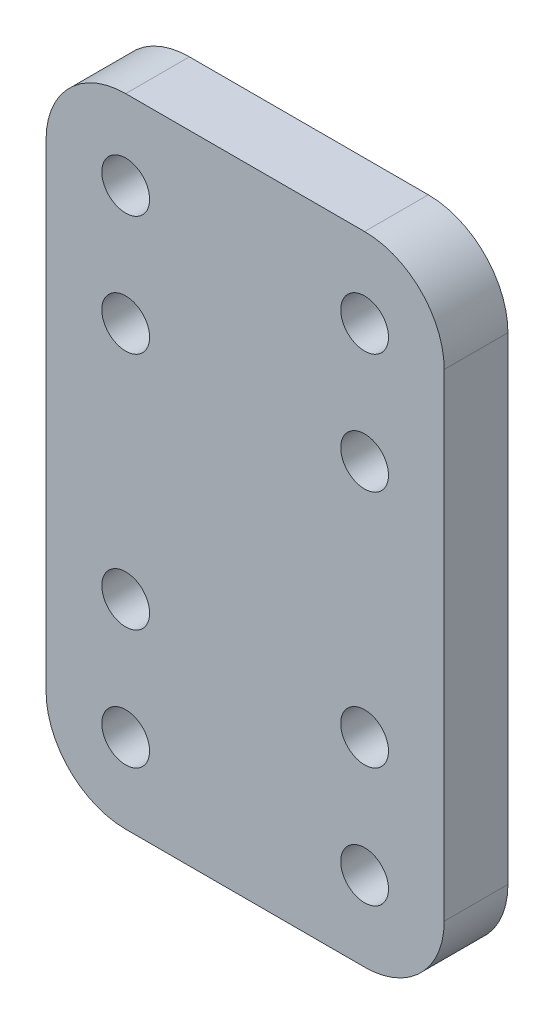
ISO-10303-21;
HEADER;
FILE_DESCRIPTION(('STEP AP214'),'2;1');
FILE_NAME('part.step','',(''),(''),'','','');
FILE_SCHEMA(('AUTOMOTIVE_DESIGN { 1 0 10303 214 1 1 1 1 }'));
ENDSEC;
DATA;
#1=APPLICATION_CONTEXT('core data for automotive mechanical design processes');
#2=APPLICATION_PROTOCOL_DEFINITION('international standard','automotive_design',2000,#1);
#3=PRODUCT_CONTEXT('',#1,'mechanical');
#4=PRODUCT('Part','Part','',(#3));
#5=PRODUCT_RELATED_PRODUCT_CATEGORY('part','',(#4));
#6=PRODUCT_DEFINITION_FORMATION('','',#4);
#7=PRODUCT_DEFINITION_CONTEXT('part definition',#1,'design');
#8=PRODUCT_DEFINITION('design','',#6,#7);
#9=PRODUCT_DEFINITION_SHAPE('','',#8);
#10=(LENGTH_UNIT() NAMED_UNIT(*) SI_UNIT(.MILLI.,.METRE.));
#11=(NAMED_UNIT(*) PLANE_ANGLE_UNIT() SI_UNIT($,.RADIAN.));
#12=(NAMED_UNIT(*) SI_UNIT($,.STERADIAN.) SOLID_ANGLE_UNIT());
#13=UNCERTAINTY_MEASURE_WITH_UNIT(LENGTH_MEASURE(1.E-05),#10,'distance_accuracy_value','');
#14=(GEOMETRIC_REPRESENTATION_CONTEXT(3) GLOBAL_UNCERTAINTY_ASSIGNED_CONTEXT((#13)) GLOBAL_UNIT_ASSIGNED_CONTEXT((#10,
#11,#12)) REPRESENTATION_CONTEXT('',''));
#15=CARTESIAN_POINT('',(0.,0.,0.));
#16=DIRECTION('',(0.,0.,1.));
#17=DIRECTION('',(1.,0.,0.));
#18=AXIS2_PLACEMENT_3D('',#15,#16,#17);
#19=CARTESIAN_POINT('',(0.,0.,4.));
#20=DIRECTION('',(0.,0.,1.));
#21=DIRECTION('',(1.,0.,0.));
#22=AXIS2_PLACEMENT_3D('',#19,#20,#21);
#23=PLANE('',#22);
#24=CARTESIAN_POINT('',(7.5,-7.5,4.));
#25=DIRECTION('',(0.,0.,1.));
#26=DIRECTION('',(1.,0.,0.));
#27=AXIS2_PLACEMENT_3D('',#24,#25,#26);
#28=CIRCLE('',#27,1.5);
#29=CARTESIAN_POINT('',(9.00000000000001,-7.5,4.));
#30=VERTEX_POINT('',#29);
#31=EDGE_CURVE('E216',#30,#30,#28,.T.);
#32=ORIENTED_EDGE('',*,*,#31,.F.);
#33=EDGE_LOOP('',(#32));
#34=FACE_BOUND('',#33,.T.);
#35=CARTESIAN_POINT('',(-7.5,7.5,4.));
#36=DIRECTION('',(0.,0.,1.));
#37=DIRECTION('',(1.,0.,0.));
#38=AXIS2_PLACEMENT_3D('',#35,#36,#37);
#39=CIRCLE('',#38,1.5);
#40=CARTESIAN_POINT('',(-6.,7.5,4.));
#41=VERTEX_POINT('',#40);
#42=EDGE_CURVE('E204',#41,#41,#39,.T.);
#43=ORIENTED_EDGE('',*,*,#42,.F.);
#44=EDGE_LOOP('',(#43));
#45=FACE_BOUND('',#44,.T.);
#46=CARTESIAN_POINT('',(-7.5,-15.,4.));
#47=DIRECTION('',(0.,0.,1.));
#48=DIRECTION('',(1.,0.,0.));
#49=AXIS2_PLACEMENT_3D('',#46,#47,#48);
#50=CIRCLE('',#49,1.5);
#51=CARTESIAN_POINT('',(-6.,-15.,4.));
#52=VERTEX_POINT('',#51);
#53=EDGE_CURVE('E192',#52,#52,#50,.T.);
#54=ORIENTED_EDGE('',*,*,#53,.F.);
#55=EDGE_LOOP('',(#54));
#56=FACE_BOUND('',#55,.T.);
#57=CARTESIAN_POINT('',(-7.5,15.,4.));
#58=DIRECTION('',(0.,0.,1.));
#59=DIRECTION('',(1.,0.,0.));
#60=AXIS2_PLACEMENT_3D('',#57,#58,#59);
#61=CIRCLE('',#60,1.5);
#62=CARTESIAN_POINT('',(-6.,15.,4.));
#63=VERTEX_POINT('',#62);
#64=EDGE_CURVE('E133',#63,#63,#61,.T.);
#65=ORIENTED_EDGE('',*,*,#64,.F.);
#66=EDGE_LOOP('',(#65));
#67=FACE_BOUND('',#66,.T.);
#68=DIRECTION('',(1.,0.,0.));
#69=VECTOR('',#68,1.);
#70=CARTESIAN_POINT('',(-12.5,-20.,4.));
#71=LINE('',#70,#69);
#72=CARTESIAN_POINT('',(-7.5,-20.,4.));
#73=VERTEX_POINT('',#72);
#74=CARTESIAN_POINT('',(7.5,-20.,4.));
#75=VERTEX_POINT('',#74);
#76=EDGE_CURVE('E142',#73,#75,#71,.T.);
#77=ORIENTED_EDGE('',*,*,#76,.T.);
#78=CARTESIAN_POINT('',(7.5,-15.,4.));
#79=DIRECTION('',(0.,0.,1.));
#80=DIRECTION('',(1.,0.,0.));
#81=AXIS2_PLACEMENT_3D('',#78,#79,#80);
#82=CIRCLE('',#81,5.);
#83=CARTESIAN_POINT('',(12.5,-15.,4.));
#84=VERTEX_POINT('',#83);
#85=EDGE_CURVE('E161',#75,#84,#82,.T.);
#86=ORIENTED_EDGE('',*,*,#85,.T.);
#87=DIRECTION('',(0.,1.,0.));
#88=VECTOR('',#87,1.);
#89=CARTESIAN_POINT('',(12.5,20.,4.));
#90=LINE('',#89,#88);
#91=CARTESIAN_POINT('',(12.5,15.,4.));
#92=VERTEX_POINT('',#91);
#93=EDGE_CURVE('E125',#84,#92,#90,.T.);
#94=ORIENTED_EDGE('',*,*,#93,.T.);
#95=CARTESIAN_POINT('',(7.5,15.,4.));
#96=DIRECTION('',(0.,0.,1.));
#97=DIRECTION('',(1.,0.,0.));
#98=AXIS2_PLACEMENT_3D('',#95,#96,#97);
#99=CIRCLE('',#98,5.);
#100=CARTESIAN_POINT('',(7.5,20.,4.));
#101=VERTEX_POINT('',#100);
#102=EDGE_CURVE('E159',#92,#101,#99,.T.);
#103=ORIENTED_EDGE('',*,*,#102,.T.);
#104=DIRECTION('',(-1.,0.,0.));
#105=VECTOR('',#104,1.);
#106=CARTESIAN_POINT('',(-12.5,20.,4.));
#107=LINE('',#106,#105);
#108=CARTESIAN_POINT('',(-7.5,20.,4.));
#109=VERTEX_POINT('',#108);
#110=EDGE_CURVE('E172',#101,#109,#107,.T.);
#111=ORIENTED_EDGE('',*,*,#110,.T.);
#112=CARTESIAN_POINT('',(-7.5,15.,4.));
#113=DIRECTION('',(0.,0.,1.));
#114=DIRECTION('',(1.,0.,0.));
#115=AXIS2_PLACEMENT_3D('',#112,#113,#114);
#116=CIRCLE('',#115,5.);
#117=CARTESIAN_POINT('',(-12.5,15.,4.));
#118=VERTEX_POINT('',#117);
#119=EDGE_CURVE('E60',#109,#118,#116,.T.);
#120=ORIENTED_EDGE('',*,*,#119,.T.);
#121=DIRECTION('',(0.,-1.,0.));
#122=VECTOR('',#121,1.);
#123=CARTESIAN_POINT('',(-12.5,20.,4.));
#124=LINE('',#123,#122);
#125=CARTESIAN_POINT('',(-12.5,-15.,4.));
#126=VERTEX_POINT('',#125);
#127=EDGE_CURVE('E180',#118,#126,#124,.T.);
#128=ORIENTED_EDGE('',*,*,#127,.T.);
#129=CARTESIAN_POINT('',(-7.5,-15.,4.));
#130=DIRECTION('',(0.,0.,1.));
#131=DIRECTION('',(1.,0.,0.));
#132=AXIS2_PLACEMENT_3D('',#129,#130,#131);
#133=CIRCLE('',#132,5.);
#134=EDGE_CURVE('E156',#126,#73,#133,.T.);
#135=ORIENTED_EDGE('',*,*,#134,.T.);
#136=EDGE_LOOP('',(#77,#86,#94,#103,#111,#120,#128,#135));
#137=FACE_BOUND('',#136,.T.);
#138=CARTESIAN_POINT('',(7.5,15.,4.));
#139=DIRECTION('',(0.,0.,1.));
#140=DIRECTION('',(1.,0.,0.));
#141=AXIS2_PLACEMENT_3D('',#138,#139,#140);
#142=CIRCLE('',#141,1.5);
#143=CARTESIAN_POINT('',(9.,15.,4.));
#144=VERTEX_POINT('',#143);
#145=EDGE_CURVE('E187',#144,#144,#142,.T.);
#146=ORIENTED_EDGE('',*,*,#145,.F.);
#147=EDGE_LOOP('',(#146));
#148=FACE_BOUND('',#147,.T.);
#149=CARTESIAN_POINT('',(7.5,-15.,4.));
#150=DIRECTION('',(0.,0.,1.));
#151=DIRECTION('',(1.,0.,0.));
#152=AXIS2_PLACEMENT_3D('',#149,#150,#151);
#153=CIRCLE('',#152,1.5);
#154=CARTESIAN_POINT('',(9.00000000000001,-15.,4.));
#155=VERTEX_POINT('',#154);
#156=EDGE_CURVE('E198',#155,#155,#153,.T.);
#157=ORIENTED_EDGE('',*,*,#156,.F.);
#158=EDGE_LOOP('',(#157));
#159=FACE_BOUND('',#158,.T.);
#160=CARTESIAN_POINT('',(7.5,7.5,4.));
#161=DIRECTION('',(0.,0.,1.));
#162=DIRECTION('',(1.,0.,0.));
#163=AXIS2_PLACEMENT_3D('',#160,#161,#162);
#164=CIRCLE('',#163,1.5);
#165=CARTESIAN_POINT('',(9.,7.5,4.));
#166=VERTEX_POINT('',#165);
#167=EDGE_CURVE('E210',#166,#166,#164,.T.);
#168=ORIENTED_EDGE('',*,*,#167,.F.);
#169=EDGE_LOOP('',(#168));
#170=FACE_BOUND('',#169,.T.);
#171=CARTESIAN_POINT('',(-7.5,-7.5,4.));
#172=DIRECTION('',(0.,0.,1.));
#173=DIRECTION('',(1.,0.,0.));
#174=AXIS2_PLACEMENT_3D('',#171,#172,#173);
#175=CIRCLE('',#174,1.5);
#176=CARTESIAN_POINT('',(-6.,-7.5,4.));
#177=VERTEX_POINT('',#176);
#178=EDGE_CURVE('E222',#177,#177,#175,.T.);
#179=ORIENTED_EDGE('',*,*,#178,.F.);
#180=EDGE_LOOP('',(#179));
#181=FACE_BOUND('',#180,.T.);
#182=ADVANCED_FACE('F39',(#34,#45,#56,#67,#137,#148,#159,#170,#181),#23,.T.);
#183=CARTESIAN_POINT('',(0.,0.,0.));
#184=DIRECTION('',(0.,0.,1.));
#185=DIRECTION('',(1.,0.,0.));
#186=AXIS2_PLACEMENT_3D('',#183,#184,#185);
#187=PLANE('',#186);
#188=DIRECTION('',(0.,1.,0.));
#189=VECTOR('',#188,1.);
#190=CARTESIAN_POINT('',(12.5,20.,0.));
#191=LINE('',#190,#189);
#192=CARTESIAN_POINT('',(12.5,-15.,0.));
#193=VERTEX_POINT('',#192);
#194=CARTESIAN_POINT('',(12.5,15.,0.));
#195=VERTEX_POINT('',#194);
#196=EDGE_CURVE('E122',#193,#195,#191,.T.);
#197=ORIENTED_EDGE('',*,*,#196,.F.);
#198=CARTESIAN_POINT('',(7.5,-15.,0.));
#199=DIRECTION('',(0.,0.,1.));
#200=DIRECTION('',(1.,0.,0.));
#201=AXIS2_PLACEMENT_3D('',#198,#199,#200);
#202=CIRCLE('',#201,5.);
#203=CARTESIAN_POINT('',(7.5,-20.,0.));
#204=VERTEX_POINT('',#203);
#205=EDGE_CURVE('E105',#193,#204,#202,.F.);
#206=ORIENTED_EDGE('',*,*,#205,.T.);
#207=DIRECTION('',(1.,0.,0.));
#208=VECTOR('',#207,1.);
#209=CARTESIAN_POINT('',(-12.5,-20.,0.));
#210=LINE('',#209,#208);
#211=CARTESIAN_POINT('',(-7.5,-20.,0.));
#212=VERTEX_POINT('',#211);
#213=EDGE_CURVE('E146',#212,#204,#210,.T.);
#214=ORIENTED_EDGE('',*,*,#213,.F.);
#215=CARTESIAN_POINT('',(-7.5,-15.,0.));
#216=DIRECTION('',(0.,0.,1.));
#217=DIRECTION('',(1.,0.,0.));
#218=AXIS2_PLACEMENT_3D('',#215,#216,#217);
#219=CIRCLE('',#218,5.);
#220=CARTESIAN_POINT('',(-12.5,-15.,0.));
#221=VERTEX_POINT('',#220);
#222=EDGE_CURVE('E126',#212,#221,#219,.F.);
#223=ORIENTED_EDGE('',*,*,#222,.T.);
#224=DIRECTION('',(0.,-1.,0.));
#225=VECTOR('',#224,1.);
#226=CARTESIAN_POINT('',(-12.5,20.,0.));
#227=LINE('',#226,#225);
#228=CARTESIAN_POINT('',(-12.5,15.,0.));
#229=VERTEX_POINT('',#228);
#230=EDGE_CURVE('E136',#229,#221,#227,.T.);
#231=ORIENTED_EDGE('',*,*,#230,.F.);
#232=CARTESIAN_POINT('',(-7.5,15.,0.));
#233=DIRECTION('',(0.,0.,1.));
#234=DIRECTION('',(1.,0.,0.));
#235=AXIS2_PLACEMENT_3D('',#232,#233,#234);
#236=CIRCLE('',#235,5.);
#237=CARTESIAN_POINT('',(-7.5,20.,0.));
#238=VERTEX_POINT('',#237);
#239=EDGE_CURVE('E150',#229,#238,#236,.F.);
#240=ORIENTED_EDGE('',*,*,#239,.T.);
#241=DIRECTION('',(-1.,0.,0.));
#242=VECTOR('',#241,1.);
#243=CARTESIAN_POINT('',(-12.5,20.,0.));
#244=LINE('',#243,#242);
#245=CARTESIAN_POINT('',(7.5,20.,0.));
#246=VERTEX_POINT('',#245);
#247=EDGE_CURVE('E132',#246,#238,#244,.T.);
#248=ORIENTED_EDGE('',*,*,#247,.F.);
#249=CARTESIAN_POINT('',(7.5,15.,0.));
#250=DIRECTION('',(0.,0.,1.));
#251=DIRECTION('',(1.,0.,0.));
#252=AXIS2_PLACEMENT_3D('',#249,#250,#251);
#253=CIRCLE('',#252,5.);
#254=EDGE_CURVE('E116',#246,#195,#253,.F.);
#255=ORIENTED_EDGE('',*,*,#254,.T.);
#256=EDGE_LOOP('',(#197,#206,#214,#223,#231,#240,#248,#255));
#257=FACE_BOUND('',#256,.T.);
#258=CARTESIAN_POINT('',(-7.5,15.,0.));
#259=DIRECTION('',(0.,0.,1.));
#260=DIRECTION('',(1.,0.,0.));
#261=AXIS2_PLACEMENT_3D('',#258,#259,#260);
#262=CIRCLE('',#261,1.5);
#263=CARTESIAN_POINT('',(-6.,15.,0.));
#264=VERTEX_POINT('',#263);
#265=EDGE_CURVE('E139',#264,#264,#262,.T.);
#266=ORIENTED_EDGE('',*,*,#265,.T.);
#267=EDGE_LOOP('',(#266));
#268=FACE_BOUND('',#267,.T.);
#269=CARTESIAN_POINT('',(7.5,15.,0.));
#270=DIRECTION('',(0.,0.,1.));
#271=DIRECTION('',(1.,0.,0.));
#272=AXIS2_PLACEMENT_3D('',#269,#270,#271);
#273=CIRCLE('',#272,1.5);
#274=CARTESIAN_POINT('',(9.,15.,0.));
#275=VERTEX_POINT('',#274);
#276=EDGE_CURVE('E189',#275,#275,#273,.T.);
#277=ORIENTED_EDGE('',*,*,#276,.T.);
#278=EDGE_LOOP('',(#277));
#279=FACE_BOUND('',#278,.T.);
#280=CARTESIAN_POINT('',(-7.5,-15.,0.));
#281=DIRECTION('',(0.,0.,1.));
#282=DIRECTION('',(1.,0.,0.));
#283=AXIS2_PLACEMENT_3D('',#280,#281,#282);
#284=CIRCLE('',#283,1.5);
#285=CARTESIAN_POINT('',(-6.,-15.,0.));
#286=VERTEX_POINT('',#285);
#287=EDGE_CURVE('E195',#286,#286,#284,.T.);
#288=ORIENTED_EDGE('',*,*,#287,.T.);
#289=EDGE_LOOP('',(#288));
#290=FACE_BOUND('',#289,.T.);
#291=CARTESIAN_POINT('',(7.5,-15.,0.));
#292=DIRECTION('',(0.,0.,1.));
#293=DIRECTION('',(1.,0.,0.));
#294=AXIS2_PLACEMENT_3D('',#291,#292,#293);
#295=CIRCLE('',#294,1.5);
#296=CARTESIAN_POINT('',(9.00000000000001,-15.,0.));
#297=VERTEX_POINT('',#296);
#298=EDGE_CURVE('E201',#297,#297,#295,.T.);
#299=ORIENTED_EDGE('',*,*,#298,.T.);
#300=EDGE_LOOP('',(#299));
#301=FACE_BOUND('',#300,.T.);
#302=CARTESIAN_POINT('',(-7.5,7.5,0.));
#303=DIRECTION('',(0.,0.,1.));
#304=DIRECTION('',(1.,0.,0.));
#305=AXIS2_PLACEMENT_3D('',#302,#303,#304);
#306=CIRCLE('',#305,1.5);
#307=CARTESIAN_POINT('',(-6.,7.5,0.));
#308=VERTEX_POINT('',#307);
#309=EDGE_CURVE('E207',#308,#308,#306,.T.);
#310=ORIENTED_EDGE('',*,*,#309,.T.);
#311=EDGE_LOOP('',(#310));
#312=FACE_BOUND('',#311,.T.);
#313=CARTESIAN_POINT('',(7.5,7.5,0.));
#314=DIRECTION('',(0.,0.,1.));
#315=DIRECTION('',(1.,0.,0.));
#316=AXIS2_PLACEMENT_3D('',#313,#314,#315);
#317=CIRCLE('',#316,1.5);
#318=CARTESIAN_POINT('',(9.,7.5,0.));
#319=VERTEX_POINT('',#318);
#320=EDGE_CURVE('E213',#319,#319,#317,.T.);
#321=ORIENTED_EDGE('',*,*,#320,.T.);
#322=EDGE_LOOP('',(#321));
#323=FACE_BOUND('',#322,.T.);
#324=CARTESIAN_POINT('',(7.5,-7.5,0.));
#325=DIRECTION('',(0.,0.,1.));
#326=DIRECTION('',(1.,0.,0.));
#327=AXIS2_PLACEMENT_3D('',#324,#325,#326);
#328=CIRCLE('',#327,1.5);
#329=CARTESIAN_POINT('',(9.00000000000001,-7.5,0.));
#330=VERTEX_POINT('',#329);
#331=EDGE_CURVE('E219',#330,#330,#328,.T.);
#332=ORIENTED_EDGE('',*,*,#331,.T.);
#333=EDGE_LOOP('',(#332));
#334=FACE_BOUND('',#333,.T.);
#335=CARTESIAN_POINT('',(-7.5,-7.5,0.));
#336=DIRECTION('',(0.,0.,1.));
#337=DIRECTION('',(1.,0.,0.));
#338=AXIS2_PLACEMENT_3D('',#335,#336,#337);
#339=CIRCLE('',#338,1.5);
#340=CARTESIAN_POINT('',(-6.,-7.5,0.));
#341=VERTEX_POINT('',#340);
#342=EDGE_CURVE('E225',#341,#341,#339,.T.);
#343=ORIENTED_EDGE('',*,*,#342,.T.);
#344=EDGE_LOOP('',(#343));
#345=FACE_BOUND('',#344,.T.);
#346=ADVANCED_FACE('F129',(#257,#268,#279,#290,#301,#312,#323,#334,#345),#187,.F.);
#347=CARTESIAN_POINT('',(12.5,20.,4.));
#348=DIRECTION('',(-1.,0.,0.));
#349=DIRECTION('',(0.,-1.,0.));
#350=AXIS2_PLACEMENT_3D('',#347,#348,#349);
#351=PLANE('',#350);
#352=ORIENTED_EDGE('',*,*,#93,.F.);
#353=DIRECTION('',(0.,0.,-1.));
#354=VECTOR('',#353,1.);
#355=CARTESIAN_POINT('',(12.5,-15.,4.));
#356=LINE('',#355,#354);
#357=EDGE_CURVE('E109',#84,#193,#356,.T.);
#358=ORIENTED_EDGE('',*,*,#357,.T.);
#359=ORIENTED_EDGE('',*,*,#196,.T.);
#360=DIRECTION('',(0.,0.,-1.));
#361=VECTOR('',#360,1.);
#362=CARTESIAN_POINT('',(12.5,15.,4.));
#363=LINE('',#362,#361);
#364=EDGE_CURVE('E127',#195,#92,#363,.F.);
#365=ORIENTED_EDGE('',*,*,#364,.T.);
#366=EDGE_LOOP('',(#352,#358,#359,#365));
#367=FACE_BOUND('',#366,.T.);
#368=ADVANCED_FACE('F121',(#367),#351,.F.);
#369=CARTESIAN_POINT('',(-12.5,20.,4.));
#370=DIRECTION('',(0.,-1.,0.));
#371=DIRECTION('',(0.,0.,-1.));
#372=AXIS2_PLACEMENT_3D('',#369,#370,#371);
#373=PLANE('',#372);
#374=ORIENTED_EDGE('',*,*,#110,.F.);
#375=DIRECTION('',(0.,0.,-1.));
#376=VECTOR('',#375,1.);
#377=CARTESIAN_POINT('',(7.5,20.,4.));
#378=LINE('',#377,#376);
#379=EDGE_CURVE('E165',#101,#246,#378,.T.);
#380=ORIENTED_EDGE('',*,*,#379,.T.);
#381=ORIENTED_EDGE('',*,*,#247,.T.);
#382=DIRECTION('',(0.,0.,-1.));
#383=VECTOR('',#382,1.);
#384=CARTESIAN_POINT('',(-7.5,20.,4.));
#385=LINE('',#384,#383);
#386=EDGE_CURVE('E163',#238,#109,#385,.F.);
#387=ORIENTED_EDGE('',*,*,#386,.T.);
#388=EDGE_LOOP('',(#374,#380,#381,#387));
#389=FACE_BOUND('',#388,.T.);
#390=ADVANCED_FACE('F170',(#389),#373,.F.);
#391=CARTESIAN_POINT('',(-12.5,20.,4.));
#392=DIRECTION('',(1.,0.,0.));
#393=DIRECTION('',(0.,1.,0.));
#394=AXIS2_PLACEMENT_3D('',#391,#392,#393);
#395=PLANE('',#394);
#396=ORIENTED_EDGE('',*,*,#127,.F.);
#397=DIRECTION('',(0.,0.,-1.));
#398=VECTOR('',#397,1.);
#399=CARTESIAN_POINT('',(-12.5,15.,4.));
#400=LINE('',#399,#398);
#401=EDGE_CURVE('E11',#118,#229,#400,.T.);
#402=ORIENTED_EDGE('',*,*,#401,.T.);
#403=ORIENTED_EDGE('',*,*,#230,.T.);
#404=DIRECTION('',(0.,0.,-1.));
#405=VECTOR('',#404,1.);
#406=CARTESIAN_POINT('',(-12.5,-15.,4.));
#407=LINE('',#406,#405);
#408=EDGE_CURVE('E47',#221,#126,#407,.F.);
#409=ORIENTED_EDGE('',*,*,#408,.T.);
#410=EDGE_LOOP('',(#396,#402,#403,#409));
#411=FACE_BOUND('',#410,.T.);
#412=ADVANCED_FACE('F179',(#411),#395,.F.);
#413=CARTESIAN_POINT('',(-12.5,-20.,4.));
#414=DIRECTION('',(0.,1.,0.));
#415=DIRECTION('',(0.,0.,1.));
#416=AXIS2_PLACEMENT_3D('',#413,#414,#415);
#417=PLANE('',#416);
#418=ORIENTED_EDGE('',*,*,#213,.T.);
#419=DIRECTION('',(0.,0.,-1.));
#420=VECTOR('',#419,1.);
#421=CARTESIAN_POINT('',(7.5,-20.,4.));
#422=LINE('',#421,#420);
#423=EDGE_CURVE('E110',#204,#75,#422,.F.);
#424=ORIENTED_EDGE('',*,*,#423,.T.);
#425=ORIENTED_EDGE('',*,*,#76,.F.);
#426=DIRECTION('',(0.,0.,-1.));
#427=VECTOR('',#426,1.);
#428=CARTESIAN_POINT('',(-7.5,-20.,4.));
#429=LINE('',#428,#427);
#430=EDGE_CURVE('E115',#73,#212,#429,.T.);
#431=ORIENTED_EDGE('',*,*,#430,.T.);
#432=EDGE_LOOP('',(#418,#424,#425,#431));
#433=FACE_BOUND('',#432,.T.);
#434=ADVANCED_FACE('F248',(#433),#417,.F.);
#435=CARTESIAN_POINT('',(-7.5,15.,4.));
#436=DIRECTION('',(0.,0.,-1.));
#437=DIRECTION('',(-1.,0.,0.));
#438=AXIS2_PLACEMENT_3D('',#435,#436,#437);
#439=CYLINDRICAL_SURFACE('',#438,1.5);
#440=ORIENTED_EDGE('',*,*,#64,.T.);
#441=EDGE_LOOP('',(#440));
#442=FACE_BOUND('',#441,.T.);
#443=ORIENTED_EDGE('',*,*,#265,.F.);
#444=EDGE_LOOP('',(#443));
#445=FACE_BOUND('',#444,.T.);
#446=ADVANCED_FACE('F245',(#442,#445),#439,.F.);
#447=CARTESIAN_POINT('',(7.5,15.,4.));
#448=DIRECTION('',(0.,0.,-1.));
#449=DIRECTION('',(-1.,0.,0.));
#450=AXIS2_PLACEMENT_3D('',#447,#448,#449);
#451=CYLINDRICAL_SURFACE('',#450,1.5);
#452=ORIENTED_EDGE('',*,*,#145,.T.);
#453=EDGE_LOOP('',(#452));
#454=FACE_BOUND('',#453,.T.);
#455=ORIENTED_EDGE('',*,*,#276,.F.);
#456=EDGE_LOOP('',(#455));
#457=FACE_BOUND('',#456,.T.);
#458=ADVANCED_FACE('F306',(#454,#457),#451,.F.);
#459=CARTESIAN_POINT('',(-7.5,-15.,4.));
#460=DIRECTION('',(0.,0.,-1.));
#461=DIRECTION('',(-1.,0.,0.));
#462=AXIS2_PLACEMENT_3D('',#459,#460,#461);
#463=CYLINDRICAL_SURFACE('',#462,1.5);
#464=ORIENTED_EDGE('',*,*,#53,.T.);
#465=EDGE_LOOP('',(#464));
#466=FACE_BOUND('',#465,.T.);
#467=ORIENTED_EDGE('',*,*,#287,.F.);
#468=EDGE_LOOP('',(#467));
#469=FACE_BOUND('',#468,.T.);
#470=ADVANCED_FACE('F303',(#466,#469),#463,.F.);
#471=CARTESIAN_POINT('',(7.5,-15.,4.));
#472=DIRECTION('',(0.,0.,-1.));
#473=DIRECTION('',(-1.,0.,0.));
#474=AXIS2_PLACEMENT_3D('',#471,#472,#473);
#475=CYLINDRICAL_SURFACE('',#474,1.5);
#476=ORIENTED_EDGE('',*,*,#156,.T.);
#477=EDGE_LOOP('',(#476));
#478=FACE_BOUND('',#477,.T.);
#479=ORIENTED_EDGE('',*,*,#298,.F.);
#480=EDGE_LOOP('',(#479));
#481=FACE_BOUND('',#480,.T.);
#482=ADVANCED_FACE('F299',(#478,#481),#475,.F.);
#483=CARTESIAN_POINT('',(-7.5,7.5,4.));
#484=DIRECTION('',(0.,0.,-1.));
#485=DIRECTION('',(-1.,0.,0.));
#486=AXIS2_PLACEMENT_3D('',#483,#484,#485);
#487=CYLINDRICAL_SURFACE('',#486,1.5);
#488=ORIENTED_EDGE('',*,*,#42,.T.);
#489=EDGE_LOOP('',(#488));
#490=FACE_BOUND('',#489,.T.);
#491=ORIENTED_EDGE('',*,*,#309,.F.);
#492=EDGE_LOOP('',(#491));
#493=FACE_BOUND('',#492,.T.);
#494=ADVANCED_FACE('F282',(#490,#493),#487,.F.);
#495=CARTESIAN_POINT('',(7.5,7.5,4.));
#496=DIRECTION('',(0.,0.,-1.));
#497=DIRECTION('',(-1.,0.,0.));
#498=AXIS2_PLACEMENT_3D('',#495,#496,#497);
#499=CYLINDRICAL_SURFACE('',#498,1.5);
#500=ORIENTED_EDGE('',*,*,#167,.T.);
#501=EDGE_LOOP('',(#500));
#502=FACE_BOUND('',#501,.T.);
#503=ORIENTED_EDGE('',*,*,#320,.F.);
#504=EDGE_LOOP('',(#503));
#505=FACE_BOUND('',#504,.T.);
#506=ADVANCED_FACE('F278',(#502,#505),#499,.F.);
#507=CARTESIAN_POINT('',(7.5,-7.5,4.));
#508=DIRECTION('',(0.,0.,-1.));
#509=DIRECTION('',(-1.,0.,0.));
#510=AXIS2_PLACEMENT_3D('',#507,#508,#509);
#511=CYLINDRICAL_SURFACE('',#510,1.5);
#512=ORIENTED_EDGE('',*,*,#31,.T.);
#513=EDGE_LOOP('',(#512));
#514=FACE_BOUND('',#513,.T.);
#515=ORIENTED_EDGE('',*,*,#331,.F.);
#516=EDGE_LOOP('',(#515));
#517=FACE_BOUND('',#516,.T.);
#518=ADVANCED_FACE('F281',(#514,#517),#511,.F.);
#519=CARTESIAN_POINT('',(-7.5,-7.5,4.));
#520=DIRECTION('',(0.,0.,-1.));
#521=DIRECTION('',(-1.,0.,0.));
#522=AXIS2_PLACEMENT_3D('',#519,#520,#521);
#523=CYLINDRICAL_SURFACE('',#522,1.5);
#524=ORIENTED_EDGE('',*,*,#178,.T.);
#525=EDGE_LOOP('',(#524));
#526=FACE_BOUND('',#525,.T.);
#527=ORIENTED_EDGE('',*,*,#342,.F.);
#528=EDGE_LOOP('',(#527));
#529=FACE_BOUND('',#528,.T.);
#530=ADVANCED_FACE('F231',(#526,#529),#523,.F.);
#531=CARTESIAN_POINT('',(7.5,-15.,4.));
#532=DIRECTION('',(0.,0.,-1.));
#533=DIRECTION('',(-1.,0.,0.));
#534=AXIS2_PLACEMENT_3D('',#531,#532,#533);
#535=CYLINDRICAL_SURFACE('',#534,5.);
#536=ORIENTED_EDGE('',*,*,#85,.F.);
#537=ORIENTED_EDGE('',*,*,#423,.F.);
#538=ORIENTED_EDGE('',*,*,#205,.F.);
#539=ORIENTED_EDGE('',*,*,#357,.F.);
#540=EDGE_LOOP('',(#536,#537,#538,#539));
#541=FACE_BOUND('',#540,.T.);
#542=ADVANCED_FACE('F108',(#541),#535,.T.);
#543=CARTESIAN_POINT('',(7.5,15.,4.));
#544=DIRECTION('',(0.,0.,-1.));
#545=DIRECTION('',(-1.,0.,0.));
#546=AXIS2_PLACEMENT_3D('',#543,#544,#545);
#547=CYLINDRICAL_SURFACE('',#546,5.);
#548=ORIENTED_EDGE('',*,*,#102,.F.);
#549=ORIENTED_EDGE('',*,*,#364,.F.);
#550=ORIENTED_EDGE('',*,*,#254,.F.);
#551=ORIENTED_EDGE('',*,*,#379,.F.);
#552=EDGE_LOOP('',(#548,#549,#550,#551));
#553=FACE_BOUND('',#552,.T.);
#554=ADVANCED_FACE('F260',(#553),#547,.T.);
#555=CARTESIAN_POINT('',(-7.5,15.,4.));
#556=DIRECTION('',(0.,0.,-1.));
#557=DIRECTION('',(-1.,0.,0.));
#558=AXIS2_PLACEMENT_3D('',#555,#556,#557);
#559=CYLINDRICAL_SURFACE('',#558,5.);
#560=ORIENTED_EDGE('',*,*,#119,.F.);
#561=ORIENTED_EDGE('',*,*,#386,.F.);
#562=ORIENTED_EDGE('',*,*,#239,.F.);
#563=ORIENTED_EDGE('',*,*,#401,.F.);
#564=EDGE_LOOP('',(#560,#561,#562,#563));
#565=FACE_BOUND('',#564,.T.);
#566=ADVANCED_FACE('F178',(#565),#559,.T.);
#567=CARTESIAN_POINT('',(-7.5,-15.,4.));
#568=DIRECTION('',(0.,0.,-1.));
#569=DIRECTION('',(-1.,0.,0.));
#570=AXIS2_PLACEMENT_3D('',#567,#568,#569);
#571=CYLINDRICAL_SURFACE('',#570,5.);
#572=ORIENTED_EDGE('',*,*,#134,.F.);
#573=ORIENTED_EDGE('',*,*,#408,.F.);
#574=ORIENTED_EDGE('',*,*,#222,.F.);
#575=ORIENTED_EDGE('',*,*,#430,.F.);
#576=EDGE_LOOP('',(#572,#573,#574,#575));
#577=FACE_BOUND('',#576,.T.);
#578=ADVANCED_FACE('F41',(#577),#571,.T.);
#579=CLOSED_SHELL('',(#182,#346,#368,#390,#412,#434,#446,#458,#470,#482,#494,#506,#518,#530,
#542,#554,#566,#578));
#580=MANIFOLD_SOLID_BREP('B2',#579);
#581=ADVANCED_BREP_SHAPE_REPRESENTATION('',(#18,#580),#14);
#582=SHAPE_DEFINITION_REPRESENTATION(#9,#581);
ENDSEC;
END-ISO-10303-21;
